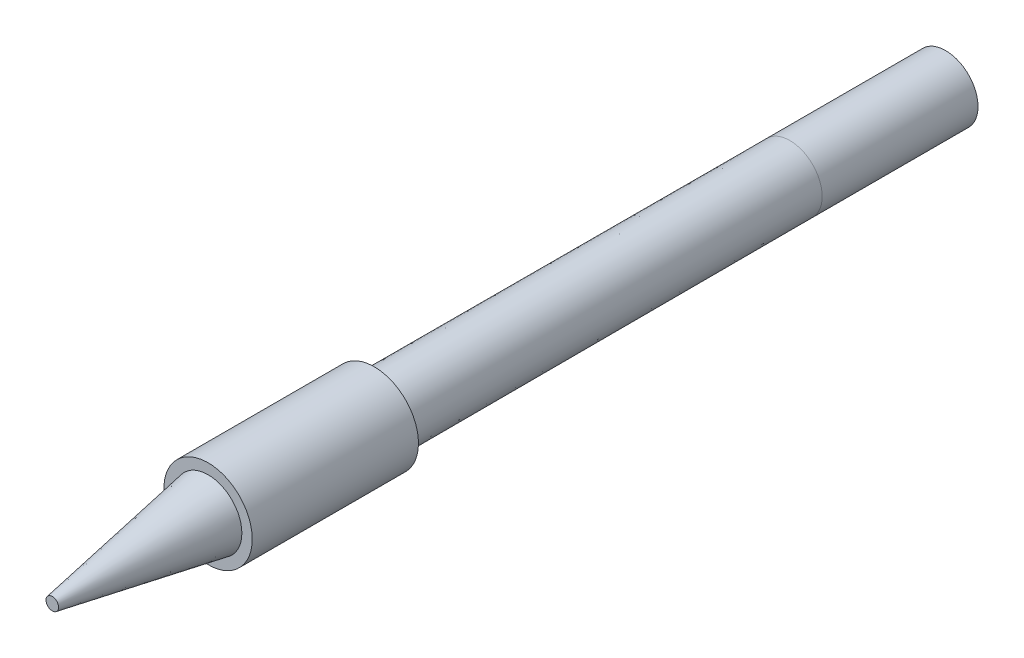
ISO-10303-21;
HEADER;
FILE_DESCRIPTION(('STEP AP214'),'2;1');
FILE_NAME('part.step','',(''),(''),'','','');
FILE_SCHEMA(('AUTOMOTIVE_DESIGN { 1 0 10303 214 1 1 1 1 }'));
ENDSEC;
DATA;
#1=APPLICATION_CONTEXT('core data for automotive mechanical design processes');
#2=APPLICATION_PROTOCOL_DEFINITION('international standard','automotive_design',2000,#1);
#3=PRODUCT_CONTEXT('',#1,'mechanical');
#4=PRODUCT('Part','Part','',(#3));
#5=PRODUCT_RELATED_PRODUCT_CATEGORY('part','',(#4));
#6=PRODUCT_DEFINITION_FORMATION('','',#4);
#7=PRODUCT_DEFINITION_CONTEXT('part definition',#1,'design');
#8=PRODUCT_DEFINITION('design','',#6,#7);
#9=PRODUCT_DEFINITION_SHAPE('','',#8);
#10=(LENGTH_UNIT() NAMED_UNIT(*) SI_UNIT(.MILLI.,.METRE.));
#11=(NAMED_UNIT(*) PLANE_ANGLE_UNIT() SI_UNIT($,.RADIAN.));
#12=(NAMED_UNIT(*) SI_UNIT($,.STERADIAN.) SOLID_ANGLE_UNIT());
#13=UNCERTAINTY_MEASURE_WITH_UNIT(LENGTH_MEASURE(1.E-05),#10,'distance_accuracy_value','');
#14=(GEOMETRIC_REPRESENTATION_CONTEXT(3) GLOBAL_UNCERTAINTY_ASSIGNED_CONTEXT((#13)) GLOBAL_UNIT_ASSIGNED_CONTEXT((#10,
#11,#12)) REPRESENTATION_CONTEXT('',''));
#15=CARTESIAN_POINT('',(0.,0.,0.));
#16=DIRECTION('',(0.,0.,1.));
#17=DIRECTION('',(1.,0.,0.));
#18=AXIS2_PLACEMENT_3D('',#15,#16,#17);
#19=CARTESIAN_POINT('',(0.,0.,0.));
#20=DIRECTION('',(0.,0.,1.));
#21=DIRECTION('',(1.,0.,0.));
#22=AXIS2_PLACEMENT_3D('',#19,#20,#21);
#23=CONICAL_SURFACE('',#22,6.225,0.00139626340159547);
#24=CARTESIAN_POINT('',(0.,0.,80.));
#25=DIRECTION('',(0.,0.,1.));
#26=DIRECTION('',(1.,0.,0.));
#27=AXIS2_PLACEMENT_3D('',#24,#25,#26);
#28=CIRCLE('',#27,6.33670114471669);
#29=CARTESIAN_POINT('',(6.33670114471669,0.,80.));
#30=VERTEX_POINT('',#29);
#31=EDGE_CURVE('E42',#30,#30,#28,.T.);
#32=ORIENTED_EDGE('',*,*,#31,.F.);
#33=EDGE_LOOP('',(#32));
#34=FACE_BOUND('',#33,.T.);
#35=CARTESIAN_POINT('',(0.,0.,0.));
#36=DIRECTION('',(0.,0.,1.));
#37=DIRECTION('',(1.,0.,0.));
#38=AXIS2_PLACEMENT_3D('',#35,#36,#37);
#39=CIRCLE('',#38,6.225);
#40=CARTESIAN_POINT('',(6.225,0.,0.));
#41=VERTEX_POINT('',#40);
#42=EDGE_CURVE('E59',#41,#41,#39,.T.);
#43=ORIENTED_EDGE('',*,*,#42,.T.);
#44=EDGE_LOOP('',(#43));
#45=FACE_BOUND('',#44,.T.);
#46=ADVANCED_FACE('F39',(#34,#45),#23,.T.);
#47=CARTESIAN_POINT('',(0.,0.,-30.));
#48=DIRECTION('',(0.,0.,1.));
#49=DIRECTION('',(1.,0.,0.));
#50=AXIS2_PLACEMENT_3D('',#47,#48,#49);
#51=CYLINDRICAL_SURFACE('',#50,6.225);
#52=CARTESIAN_POINT('',(0.,0.,-30.));
#53=DIRECTION('',(0.,0.,1.));
#54=DIRECTION('',(1.,0.,0.));
#55=AXIS2_PLACEMENT_3D('',#52,#53,#54);
#56=CIRCLE('',#55,6.225);
#57=CARTESIAN_POINT('',(6.225,0.,-30.));
#58=VERTEX_POINT('',#57);
#59=EDGE_CURVE('E50',#58,#58,#56,.T.);
#60=ORIENTED_EDGE('',*,*,#59,.T.);
#61=EDGE_LOOP('',(#60));
#62=FACE_BOUND('',#61,.T.);
#63=ORIENTED_EDGE('',*,*,#42,.F.);
#64=EDGE_LOOP('',(#63));
#65=FACE_BOUND('',#64,.T.);
#66=ADVANCED_FACE('F67',(#62,#65),#51,.T.);
#67=CARTESIAN_POINT('',(0.,0.,-30.));
#68=DIRECTION('',(0.,0.,1.));
#69=DIRECTION('',(1.,0.,0.));
#70=AXIS2_PLACEMENT_3D('',#67,#68,#69);
#71=PLANE('',#70);
#72=ORIENTED_EDGE('',*,*,#59,.F.);
#73=EDGE_LOOP('',(#72));
#74=FACE_BOUND('',#73,.T.);
#75=ADVANCED_FACE('F69',(#74),#71,.F.);
#76=CARTESIAN_POINT('',(0.,0.,112.));
#77=DIRECTION('',(0.,0.,-1.));
#78=DIRECTION('',(-1.,0.,0.));
#79=AXIS2_PLACEMENT_3D('',#76,#77,#78);
#80=CYLINDRICAL_SURFACE('',#79,8.5);
#81=CARTESIAN_POINT('',(0.,0.,112.));
#82=DIRECTION('',(0.,0.,1.));
#83=DIRECTION('',(1.,0.,0.));
#84=AXIS2_PLACEMENT_3D('',#81,#82,#83);
#85=CIRCLE('',#84,8.5);
#86=CARTESIAN_POINT('',(8.5,0.,112.));
#87=VERTEX_POINT('',#86);
#88=EDGE_CURVE('E56',#87,#87,#85,.T.);
#89=ORIENTED_EDGE('',*,*,#88,.F.);
#90=EDGE_LOOP('',(#89));
#91=FACE_BOUND('',#90,.T.);
#92=CARTESIAN_POINT('',(0.,0.,80.));
#93=DIRECTION('',(0.,0.,1.));
#94=DIRECTION('',(1.,0.,0.));
#95=AXIS2_PLACEMENT_3D('',#92,#93,#94);
#96=CIRCLE('',#95,8.5);
#97=CARTESIAN_POINT('',(8.5,0.,80.));
#98=VERTEX_POINT('',#97);
#99=EDGE_CURVE('E55',#98,#98,#96,.T.);
#100=ORIENTED_EDGE('',*,*,#99,.T.);
#101=EDGE_LOOP('',(#100));
#102=FACE_BOUND('',#101,.T.);
#103=ADVANCED_FACE('F75',(#91,#102),#80,.T.);
#104=CARTESIAN_POINT('',(0.,0.,112.));
#105=DIRECTION('',(0.,0.,1.));
#106=DIRECTION('',(1.,0.,0.));
#107=AXIS2_PLACEMENT_3D('',#104,#105,#106);
#108=PLANE('',#107);
#109=CARTESIAN_POINT('',(0.,0.,112.));
#110=DIRECTION('',(0.,0.,1.));
#111=DIRECTION('',(1.,0.,0.));
#112=AXIS2_PLACEMENT_3D('',#109,#110,#111);
#113=CIRCLE('',#112,6.5);
#114=CARTESIAN_POINT('',(6.5,0.,112.));
#115=VERTEX_POINT('',#114);
#116=EDGE_CURVE('E10',#115,#115,#113,.T.);
#117=ORIENTED_EDGE('',*,*,#116,.F.);
#118=EDGE_LOOP('',(#117));
#119=FACE_BOUND('',#118,.T.);
#120=ORIENTED_EDGE('',*,*,#88,.T.);
#121=EDGE_LOOP('',(#120));
#122=FACE_BOUND('',#121,.T.);
#123=ADVANCED_FACE('F82',(#119,#122),#108,.T.);
#124=CARTESIAN_POINT('',(0.,0.,80.));
#125=DIRECTION('',(0.,0.,1.));
#126=DIRECTION('',(1.,0.,0.));
#127=AXIS2_PLACEMENT_3D('',#124,#125,#126);
#128=PLANE('',#127);
#129=ORIENTED_EDGE('',*,*,#31,.T.);
#130=EDGE_LOOP('',(#129));
#131=FACE_BOUND('',#130,.T.);
#132=ORIENTED_EDGE('',*,*,#99,.F.);
#133=EDGE_LOOP('',(#132));
#134=FACE_BOUND('',#133,.T.);
#135=ADVANCED_FACE('F84',(#131,#134),#128,.F.);
#136=CARTESIAN_POINT('',(0.,0.,112.));
#137=DIRECTION('',(0.,0.,-1.));
#138=DIRECTION('',(1.,0.,0.));
#139=AXIS2_PLACEMENT_3D('',#136,#137,#138);
#140=CONICAL_SURFACE('',#139,6.5,0.174532925199433);
#141=CARTESIAN_POINT('',(0.,0.,142.));
#142=DIRECTION('',(0.,0.,1.));
#143=DIRECTION('',(1.,0.,0.));
#144=AXIS2_PLACEMENT_3D('',#141,#142,#143);
#145=CIRCLE('',#144,1.21019057874604);
#146=CARTESIAN_POINT('',(1.21019057874604,0.,142.));
#147=VERTEX_POINT('',#146);
#148=EDGE_CURVE('E52',#147,#147,#145,.T.);
#149=CARTESIAN_POINT('',(1.21019057874604,0.,142.));
#150=CARTESIAN_POINT('',(1.26529276021743,0.,141.6875));
#151=CARTESIAN_POINT('',(1.32039494168883,0.,141.375));
#152=CARTESIAN_POINT('',(1.43059930463162,0.,140.75));
#153=CARTESIAN_POINT('',(1.48570148610302,0.,140.4375));
#154=CARTESIAN_POINT('',(1.59590584904581,0.,139.8125));
#155=CARTESIAN_POINT('',(1.6510080305172,0.,139.5));
#156=CARTESIAN_POINT('',(1.76121239345999,0.,138.875));
#157=CARTESIAN_POINT('',(1.81631457493139,0.,138.5625));
#158=CARTESIAN_POINT('',(1.92651893787418,0.,137.9375));
#159=CARTESIAN_POINT('',(1.98162111934557,0.,137.625));
#160=CARTESIAN_POINT('',(2.09182548228836,0.,137.));
#161=CARTESIAN_POINT('',(2.14692766375976,0.,136.6875));
#162=CARTESIAN_POINT('',(2.25713202670255,0.,136.0625));
#163=CARTESIAN_POINT('',(2.31223420817395,0.,135.75));
#164=CARTESIAN_POINT('',(2.42243857111674,0.,135.125));
#165=CARTESIAN_POINT('',(2.47754075258813,0.,134.8125));
#166=CARTESIAN_POINT('',(2.58774511553092,0.,134.1875));
#167=CARTESIAN_POINT('',(2.64284729700232,0.,133.875));
#168=CARTESIAN_POINT('',(2.75305165994511,0.,133.25));
#169=CARTESIAN_POINT('',(2.8081538414165,0.,132.9375));
#170=CARTESIAN_POINT('',(2.9183582043593,0.,132.3125));
#171=CARTESIAN_POINT('',(2.97346038583069,0.,132.));
#172=CARTESIAN_POINT('',(3.08366474877348,0.,131.375));
#173=CARTESIAN_POINT('',(3.13876693024488,0.,131.0625));
#174=CARTESIAN_POINT('',(3.24897129318767,0.,130.4375));
#175=CARTESIAN_POINT('',(3.30407347465907,0.,130.125));
#176=CARTESIAN_POINT('',(3.41427783760186,0.,129.5));
#177=CARTESIAN_POINT('',(3.46938001907325,0.,129.1875));
#178=CARTESIAN_POINT('',(3.57958438201604,0.,128.5625));
#179=CARTESIAN_POINT('',(3.63468656348744,0.,128.25));
#180=CARTESIAN_POINT('',(3.74489092643023,0.,127.625));
#181=CARTESIAN_POINT('',(3.79999310790162,0.,127.3125));
#182=CARTESIAN_POINT('',(3.91019747084441,0.,126.6875));
#183=CARTESIAN_POINT('',(3.96529965231581,0.,126.375));
#184=CARTESIAN_POINT('',(4.0755040152586,0.,125.75));
#185=CARTESIAN_POINT('',(4.13060619673,0.,125.4375));
#186=CARTESIAN_POINT('',(4.24081055967279,0.,124.8125));
#187=CARTESIAN_POINT('',(4.29591274114418,0.,124.5));
#188=CARTESIAN_POINT('',(4.40611710408697,0.,123.875));
#189=CARTESIAN_POINT('',(4.46121928555837,0.,123.5625));
#190=CARTESIAN_POINT('',(4.57142364850116,0.,122.9375));
#191=CARTESIAN_POINT('',(4.62652582997255,0.,122.625));
#192=CARTESIAN_POINT('',(4.73673019291534,0.,122.));
#193=CARTESIAN_POINT('',(4.79183237438674,0.,121.6875));
#194=CARTESIAN_POINT('',(4.90203673732953,0.,121.0625));
#195=CARTESIAN_POINT('',(4.95713891880093,0.,120.75));
#196=CARTESIAN_POINT('',(5.06734328174372,0.,120.125));
#197=CARTESIAN_POINT('',(5.12244546321511,0.,119.8125));
#198=CARTESIAN_POINT('',(5.23264982615791,0.,119.1875));
#199=CARTESIAN_POINT('',(5.2877520076293,0.,118.875));
#200=CARTESIAN_POINT('',(5.39795637057209,0.,118.25));
#201=CARTESIAN_POINT('',(5.45305855204349,0.,117.9375));
#202=CARTESIAN_POINT('',(5.56326291498628,0.,117.3125));
#203=CARTESIAN_POINT('',(5.61836509645767,0.,117.));
#204=CARTESIAN_POINT('',(5.72856945940046,0.,116.375));
#205=CARTESIAN_POINT('',(5.78367164087186,0.,116.0625));
#206=CARTESIAN_POINT('',(5.89387600381465,0.,115.4375));
#207=CARTESIAN_POINT('',(5.94897818528605,0.,115.125));
#208=CARTESIAN_POINT('',(6.05918254822884,0.,114.5));
#209=CARTESIAN_POINT('',(6.11428472970023,0.,114.1875));
#210=CARTESIAN_POINT('',(6.22448909264302,0.,113.5625));
#211=CARTESIAN_POINT('',(6.27959127411442,0.,113.25));
#212=CARTESIAN_POINT('',(6.38979563705721,0.,112.625));
#213=CARTESIAN_POINT('',(6.4448978185286,0.,112.3125));
#214=CARTESIAN_POINT('',(6.5,0.,112.));
#215=B_SPLINE_CURVE_WITH_KNOTS('',3,(#149,#150,#151,#152,#153,#154,#155,#156,#157,#158,#159,
#160,#161,#162,#163,#164,#165,#166,#167,#168,#169,#170,#171,#172,#173,#174,#175,#176,#177,#178,
#179,#180,#181,#182,#183,#184,#185,#186,#187,#188,#189,#190,#191,#192,#193,#194,#195,#196,#197,
#198,#199,#200,#201,#202,#203,#204,#205,#206,#207,#208,#209,#210,#211,#212,#213,#214),
.UNSPECIFIED.,.F.,.F.,(4,2,2,2,2,2,2,2,2,2,2,2,2,2,2,2,2,2,2,2,2,2,2,2,2,2,2,2,2,2,2,2,4),(0.,
0.951962448642894,1.90392489728579,2.85588734592868,3.80784979457155,4.75981224321444,
5.71177469185733,6.66373714050023,7.61569958914309,8.56766203778599,9.51962448642888,
10.4715869350717,11.4235493837146,12.3755118323575,13.3274742810004,14.2794367296433,
15.2313991782862,16.1833616269291,17.135324075572,18.0872865242148,19.0392489728577,
19.9912114215006,20.9431738701435,21.8951363187864,22.8470987674293,23.7990612160722,
24.7510236647151,25.7029861133579,26.6549485620008,27.6069110106437,28.5588734592866,
29.5108359079295,30.4627983565724),.UNSPECIFIED.);
#216=EDGE_CURVE('BSEAM87',#147,#115,#215,.T.);
#217=ORIENTED_EDGE('',*,*,#148,.F.);
#218=ORIENTED_EDGE('',*,*,#116,.T.);
#219=ORIENTED_EDGE('',*,*,#216,.T.);
#220=ORIENTED_EDGE('',*,*,#216,.F.);
#221=EDGE_LOOP('',(#217,#219,#218,#220));
#222=FACE_BOUND('',#221,.T.);
#223=ADVANCED_FACE('F87',(#222),#140,.T.);
#224=CARTESIAN_POINT('',(0.,0.,142.));
#225=DIRECTION('',(0.,0.,1.));
#226=DIRECTION('',(1.,0.,0.));
#227=AXIS2_PLACEMENT_3D('',#224,#225,#226);
#228=PLANE('',#227);
#229=ORIENTED_EDGE('',*,*,#148,.T.);
#230=EDGE_LOOP('',(#229));
#231=FACE_BOUND('',#230,.T.);
#232=ADVANCED_FACE('F94',(#231),#228,.T.);
#233=CLOSED_SHELL('',(#46,#66,#75,#103,#123,#135,#223,#232));
#234=MANIFOLD_SOLID_BREP('B2',#233);
#235=ADVANCED_BREP_SHAPE_REPRESENTATION('',(#18,#234),#14);
#236=SHAPE_DEFINITION_REPRESENTATION(#9,#235);
ENDSEC;
END-ISO-10303-21;
